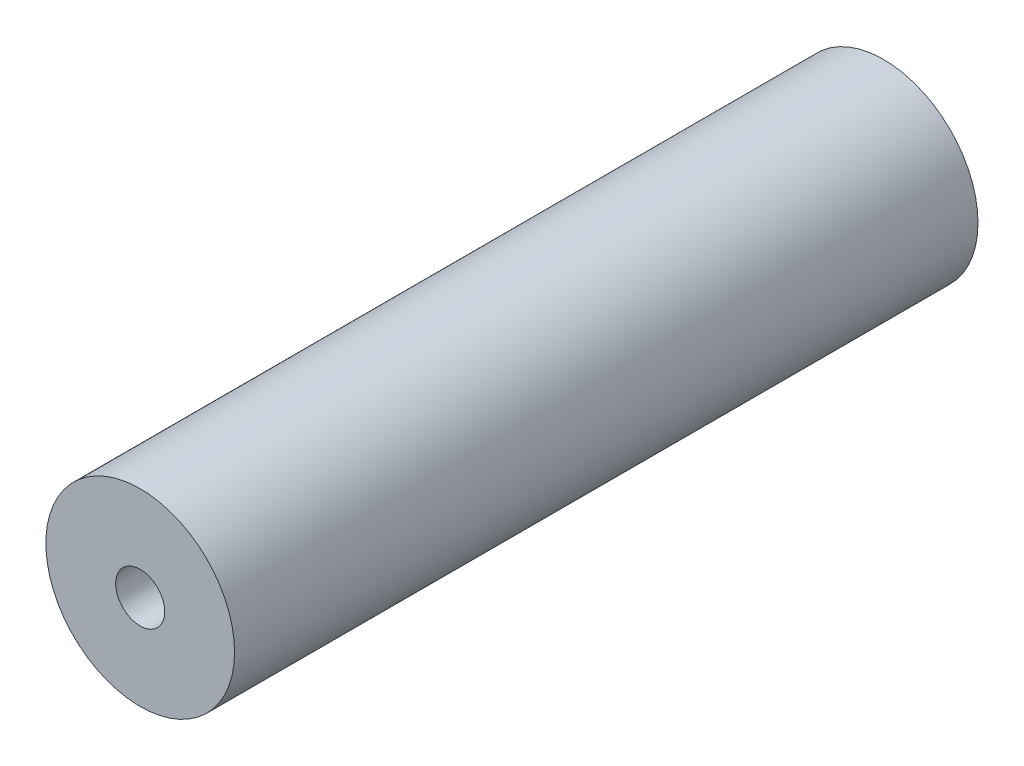
ISO-10303-21;
HEADER;
FILE_DESCRIPTION(('STEP AP214'),'2;1');
FILE_NAME('part.step','',(''),(''),'','','');
FILE_SCHEMA(('AUTOMOTIVE_DESIGN { 1 0 10303 214 1 1 1 1 }'));
ENDSEC;
DATA;
#1=APPLICATION_CONTEXT('core data for automotive mechanical design processes');
#2=APPLICATION_PROTOCOL_DEFINITION('international standard','automotive_design',2000,#1);
#3=PRODUCT_CONTEXT('',#1,'mechanical');
#4=PRODUCT('Part','Part','',(#3));
#5=PRODUCT_RELATED_PRODUCT_CATEGORY('part','',(#4));
#6=PRODUCT_DEFINITION_FORMATION('','',#4);
#7=PRODUCT_DEFINITION_CONTEXT('part definition',#1,'design');
#8=PRODUCT_DEFINITION('design','',#6,#7);
#9=PRODUCT_DEFINITION_SHAPE('','',#8);
#10=(LENGTH_UNIT() NAMED_UNIT(*) SI_UNIT(.MILLI.,.METRE.));
#11=(NAMED_UNIT(*) PLANE_ANGLE_UNIT() SI_UNIT($,.RADIAN.));
#12=(NAMED_UNIT(*) SI_UNIT($,.STERADIAN.) SOLID_ANGLE_UNIT());
#13=UNCERTAINTY_MEASURE_WITH_UNIT(LENGTH_MEASURE(1.E-05),#10,'distance_accuracy_value','');
#14=(GEOMETRIC_REPRESENTATION_CONTEXT(3) GLOBAL_UNCERTAINTY_ASSIGNED_CONTEXT((#13)) GLOBAL_UNIT_ASSIGNED_CONTEXT((#10,
#11,#12)) REPRESENTATION_CONTEXT('',''));
#15=CARTESIAN_POINT('',(0.,0.,0.));
#16=DIRECTION('',(0.,0.,1.));
#17=DIRECTION('',(1.,0.,0.));
#18=AXIS2_PLACEMENT_3D('',#15,#16,#17);
#19=CARTESIAN_POINT('',(0.,0.,39.4));
#20=DIRECTION('',(0.,0.,1.));
#21=DIRECTION('',(1.,0.,0.));
#22=AXIS2_PLACEMENT_3D('',#19,#20,#21);
#23=PLANE('',#22);
#24=CARTESIAN_POINT('',(0.,0.,39.4));
#25=DIRECTION('',(0.,0.,1.));
#26=DIRECTION('',(1.,0.,0.));
#27=AXIS2_PLACEMENT_3D('',#24,#25,#26);
#28=CIRCLE('',#27,5.);
#29=CARTESIAN_POINT('',(5.,0.,39.4));
#30=VERTEX_POINT('',#29);
#31=EDGE_CURVE('E10',#30,#30,#28,.T.);
#32=ORIENTED_EDGE('',*,*,#31,.T.);
#33=EDGE_LOOP('',(#32));
#34=FACE_BOUND('',#33,.T.);
#35=CARTESIAN_POINT('',(0.,0.,39.4));
#36=DIRECTION('',(0.,0.,1.));
#37=DIRECTION('',(1.,0.,0.));
#38=AXIS2_PLACEMENT_3D('',#35,#36,#37);
#39=CIRCLE('',#38,1.3);
#40=CARTESIAN_POINT('',(1.3,0.,39.4));
#41=VERTEX_POINT('',#40);
#42=EDGE_CURVE('E44',#41,#41,#39,.T.);
#43=ORIENTED_EDGE('',*,*,#42,.F.);
#44=EDGE_LOOP('',(#43));
#45=FACE_BOUND('',#44,.T.);
#46=ADVANCED_FACE('F33',(#34,#45),#23,.T.);
#47=CARTESIAN_POINT('',(0.,0.,0.));
#48=DIRECTION('',(0.,0.,1.));
#49=DIRECTION('',(1.,0.,0.));
#50=AXIS2_PLACEMENT_3D('',#47,#48,#49);
#51=PLANE('',#50);
#52=CARTESIAN_POINT('',(0.,0.,0.));
#53=DIRECTION('',(0.,0.,1.));
#54=DIRECTION('',(1.,0.,0.));
#55=AXIS2_PLACEMENT_3D('',#52,#53,#54);
#56=CIRCLE('',#55,5.);
#57=CARTESIAN_POINT('',(5.,0.,0.));
#58=VERTEX_POINT('',#57);
#59=EDGE_CURVE('E37',#58,#58,#56,.T.);
#60=ORIENTED_EDGE('',*,*,#59,.F.);
#61=EDGE_LOOP('',(#60));
#62=FACE_BOUND('',#61,.T.);
#63=CARTESIAN_POINT('',(0.,0.,0.));
#64=DIRECTION('',(0.,0.,1.));
#65=DIRECTION('',(1.,0.,0.));
#66=AXIS2_PLACEMENT_3D('',#63,#64,#65);
#67=CIRCLE('',#66,1.3);
#68=CARTESIAN_POINT('',(1.3,0.,0.));
#69=VERTEX_POINT('',#68);
#70=EDGE_CURVE('E46',#69,#69,#67,.T.);
#71=ORIENTED_EDGE('',*,*,#70,.T.);
#72=EDGE_LOOP('',(#71));
#73=FACE_BOUND('',#72,.T.);
#74=ADVANCED_FACE('F56',(#62,#73),#51,.F.);
#75=CARTESIAN_POINT('',(0.,0.,39.4));
#76=DIRECTION('',(0.,0.,-1.));
#77=DIRECTION('',(-1.,0.,0.));
#78=AXIS2_PLACEMENT_3D('',#75,#76,#77);
#79=CYLINDRICAL_SURFACE('',#78,5.);
#80=ORIENTED_EDGE('',*,*,#31,.F.);
#81=EDGE_LOOP('',(#80));
#82=FACE_BOUND('',#81,.T.);
#83=ORIENTED_EDGE('',*,*,#59,.T.);
#84=EDGE_LOOP('',(#83));
#85=FACE_BOUND('',#84,.T.);
#86=ADVANCED_FACE('F35',(#82,#85),#79,.T.);
#87=CARTESIAN_POINT('',(0.,0.,39.4));
#88=DIRECTION('',(0.,0.,-1.));
#89=DIRECTION('',(-1.,0.,0.));
#90=AXIS2_PLACEMENT_3D('',#87,#88,#89);
#91=CYLINDRICAL_SURFACE('',#90,1.3);
#92=ORIENTED_EDGE('',*,*,#42,.T.);
#93=EDGE_LOOP('',(#92));
#94=FACE_BOUND('',#93,.T.);
#95=ORIENTED_EDGE('',*,*,#70,.F.);
#96=EDGE_LOOP('',(#95));
#97=FACE_BOUND('',#96,.T.);
#98=ADVANCED_FACE('F52',(#94,#97),#91,.F.);
#99=CLOSED_SHELL('',(#46,#74,#86,#98));
#100=MANIFOLD_SOLID_BREP('B2',#99);
#101=ADVANCED_BREP_SHAPE_REPRESENTATION('',(#18,#100),#14);
#102=SHAPE_DEFINITION_REPRESENTATION(#9,#101);
ENDSEC;
END-ISO-10303-21;
